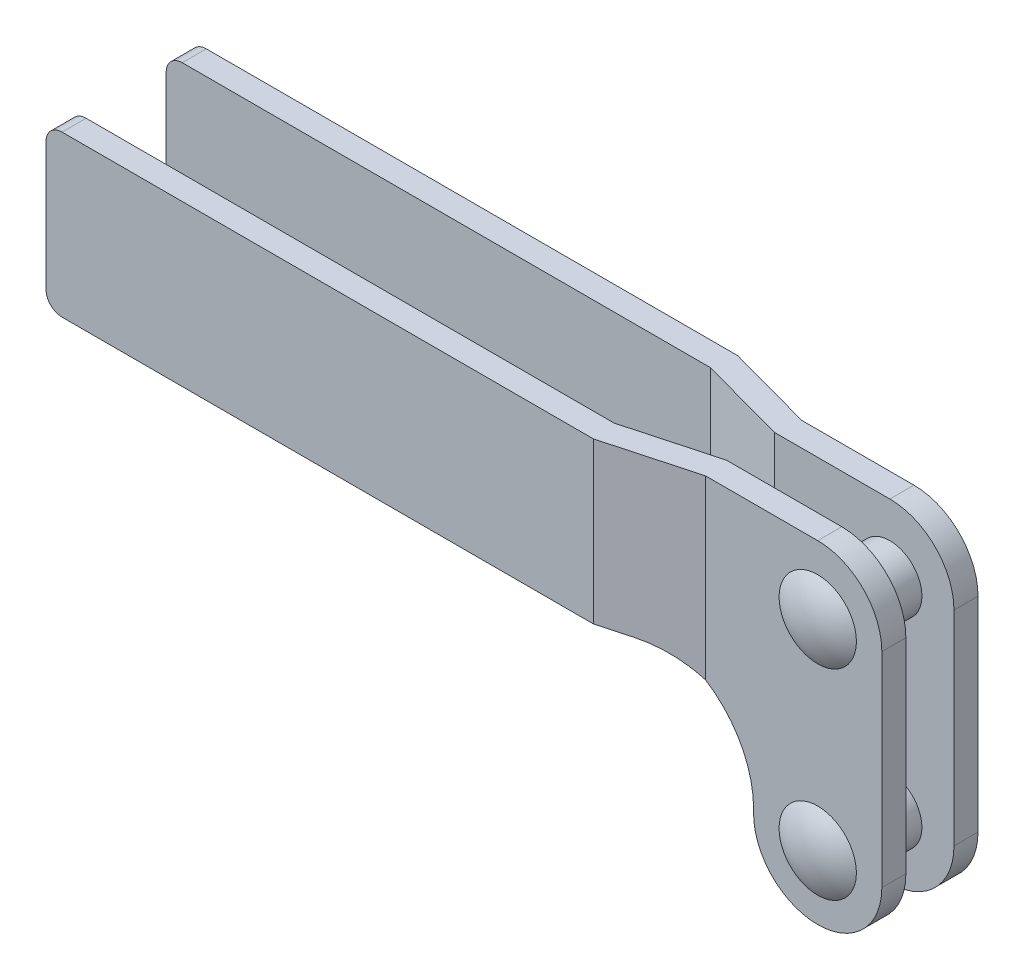
ISO-10303-21;
HEADER;
FILE_DESCRIPTION(('STEP AP214'),'2;1');
FILE_NAME('part.step','',(''),(''),'','','');
FILE_SCHEMA(('AUTOMOTIVE_DESIGN { 1 0 10303 214 1 1 1 1 }'));
ENDSEC;
DATA;
#1=APPLICATION_CONTEXT('core data for automotive mechanical design processes');
#2=APPLICATION_PROTOCOL_DEFINITION('international standard','automotive_design',2000,#1);
#3=PRODUCT_CONTEXT('',#1,'mechanical');
#4=PRODUCT('Part','Part','',(#3));
#5=PRODUCT_RELATED_PRODUCT_CATEGORY('part','',(#4));
#6=PRODUCT_DEFINITION_FORMATION('','',#4);
#7=PRODUCT_DEFINITION_CONTEXT('part definition',#1,'design');
#8=PRODUCT_DEFINITION('design','',#6,#7);
#9=PRODUCT_DEFINITION_SHAPE('','',#8);
#10=(LENGTH_UNIT() NAMED_UNIT(*) SI_UNIT(.MILLI.,.METRE.));
#11=(NAMED_UNIT(*) PLANE_ANGLE_UNIT() SI_UNIT($,.RADIAN.));
#12=(NAMED_UNIT(*) SI_UNIT($,.STERADIAN.) SOLID_ANGLE_UNIT());
#13=UNCERTAINTY_MEASURE_WITH_UNIT(LENGTH_MEASURE(1.E-05),#10,'distance_accuracy_value','');
#14=(GEOMETRIC_REPRESENTATION_CONTEXT(3) GLOBAL_UNCERTAINTY_ASSIGNED_CONTEXT((#13)) GLOBAL_UNIT_ASSIGNED_CONTEXT((#10,
#11,#12)) REPRESENTATION_CONTEXT('',''));
#15=CARTESIAN_POINT('',(0.,0.,0.));
#16=DIRECTION('',(0.,0.,1.));
#17=DIRECTION('',(1.,0.,0.));
#18=AXIS2_PLACEMENT_3D('',#15,#16,#17);
#19=CARTESIAN_POINT('',(-25.4017542509914,33.5,6.));
#20=DIRECTION('',(0.,0.,1.));
#21=DIRECTION('',(1.,0.,0.));
#22=AXIS2_PLACEMENT_3D('',#19,#20,#21);
#23=PLANE('',#22);
#24=CARTESIAN_POINT('',(-91.3,31.5,6.));
#25=DIRECTION('',(0.,0.,1.));
#26=DIRECTION('',(1.,0.,0.));
#27=AXIS2_PLACEMENT_3D('',#24,#25,#26);
#28=CIRCLE('',#27,2.);
#29=CARTESIAN_POINT('',(-91.3,33.5,6.));
#30=VERTEX_POINT('',#29);
#31=CARTESIAN_POINT('',(-93.3,31.5,6.));
#32=VERTEX_POINT('',#31);
#33=EDGE_CURVE('E301',#30,#32,#28,.T.);
#34=ORIENTED_EDGE('',*,*,#33,.F.);
#35=DIRECTION('',(-1.,0.,0.));
#36=VECTOR('',#35,1.);
#37=CARTESIAN_POINT('',(-25.4017542509914,33.5,6.));
#38=LINE('',#37,#36);
#39=CARTESIAN_POINT('',(-25.4017542509914,33.5,6.));
#40=VERTEX_POINT('',#39);
#41=EDGE_CURVE('E391',#40,#30,#38,.T.);
#42=ORIENTED_EDGE('',*,*,#41,.F.);
#43=DIRECTION('',(0.,-1.,0.));
#44=VECTOR('',#43,1.);
#45=CARTESIAN_POINT('',(-25.4017542509914,33.5,6.));
#46=LINE('',#45,#44);
#47=CARTESIAN_POINT('',(-25.4017542509914,13.5,6.));
#48=VERTEX_POINT('',#47);
#49=EDGE_CURVE('E405',#40,#48,#46,.T.);
#50=ORIENTED_EDGE('',*,*,#49,.T.);
#51=DIRECTION('',(1.,0.,0.));
#52=VECTOR('',#51,1.);
#53=CARTESIAN_POINT('',(-25.4017542509914,13.5,6.));
#54=LINE('',#53,#52);
#55=CARTESIAN_POINT('',(-91.3,13.5,6.));
#56=VERTEX_POINT('',#55);
#57=EDGE_CURVE('E49',#56,#48,#54,.T.);
#58=ORIENTED_EDGE('',*,*,#57,.F.);
#59=CARTESIAN_POINT('',(-91.3,15.5,6.));
#60=DIRECTION('',(0.,0.,1.));
#61=DIRECTION('',(1.,0.,0.));
#62=AXIS2_PLACEMENT_3D('',#59,#60,#61);
#63=CIRCLE('',#62,1.99999999999999);
#64=CARTESIAN_POINT('',(-93.3,15.5,6.));
#65=VERTEX_POINT('',#64);
#66=EDGE_CURVE('E224',#65,#56,#63,.T.);
#67=ORIENTED_EDGE('',*,*,#66,.F.);
#68=DIRECTION('',(0.,-1.,0.));
#69=VECTOR('',#68,1.);
#70=CARTESIAN_POINT('',(-93.3,33.5,6.));
#71=LINE('',#70,#69);
#72=EDGE_CURVE('E423',#32,#65,#71,.T.);
#73=ORIENTED_EDGE('',*,*,#72,.F.);
#74=EDGE_LOOP('',(#34,#42,#50,#58,#67,#73));
#75=FACE_BOUND('',#74,.T.);
#76=ADVANCED_FACE('F35',(#75),#23,.F.);
#77=CARTESIAN_POINT('',(-93.3,33.5,6.));
#78=DIRECTION('',(1.,0.,0.));
#79=DIRECTION('',(0.,0.,-1.));
#80=AXIS2_PLACEMENT_3D('',#77,#78,#79);
#81=PLANE('',#80);
#82=ORIENTED_EDGE('',*,*,#72,.T.);
#83=DIRECTION('',(0.,0.,1.));
#84=VECTOR('',#83,1.);
#85=CARTESIAN_POINT('',(-93.3,15.5,-9.));
#86=LINE('',#85,#84);
#87=CARTESIAN_POINT('',(-93.3,15.5,9.));
#88=VERTEX_POINT('',#87);
#89=EDGE_CURVE('E256',#65,#88,#86,.T.);
#90=ORIENTED_EDGE('',*,*,#89,.T.);
#91=DIRECTION('',(0.,-1.,0.));
#92=VECTOR('',#91,1.);
#93=CARTESIAN_POINT('',(-93.3,33.5,9.));
#94=LINE('',#93,#92);
#95=CARTESIAN_POINT('',(-93.3,31.5,9.));
#96=VERTEX_POINT('',#95);
#97=EDGE_CURVE('E243',#96,#88,#94,.T.);
#98=ORIENTED_EDGE('',*,*,#97,.F.);
#99=DIRECTION('',(0.,0.,1.));
#100=VECTOR('',#99,1.);
#101=CARTESIAN_POINT('',(-93.3,31.5,-9.));
#102=LINE('',#101,#100);
#103=EDGE_CURVE('E259',#32,#96,#102,.T.);
#104=ORIENTED_EDGE('',*,*,#103,.F.);
#105=EDGE_LOOP('',(#82,#90,#98,#104));
#106=FACE_BOUND('',#105,.T.);
#107=ADVANCED_FACE('F533',(#106),#81,.F.);
#108=CARTESIAN_POINT('',(-93.3,33.5,9.));
#109=DIRECTION('',(0.,0.,-1.));
#110=DIRECTION('',(-1.,0.,0.));
#111=AXIS2_PLACEMENT_3D('',#108,#109,#110);
#112=PLANE('',#111);
#113=CARTESIAN_POINT('',(-91.3,31.5,9.));
#114=DIRECTION('',(0.,0.,1.));
#115=DIRECTION('',(1.,0.,0.));
#116=AXIS2_PLACEMENT_3D('',#113,#114,#115);
#117=CIRCLE('',#116,2.);
#118=CARTESIAN_POINT('',(-91.3,33.5,9.));
#119=VERTEX_POINT('',#118);
#120=EDGE_CURVE('E237',#119,#96,#117,.T.);
#121=ORIENTED_EDGE('',*,*,#120,.T.);
#122=ORIENTED_EDGE('',*,*,#97,.T.);
#123=CARTESIAN_POINT('',(-91.3,15.5,9.));
#124=DIRECTION('',(0.,0.,1.));
#125=DIRECTION('',(1.,0.,0.));
#126=AXIS2_PLACEMENT_3D('',#123,#124,#125);
#127=CIRCLE('',#126,1.99999999999999);
#128=CARTESIAN_POINT('',(-91.3,13.5,9.));
#129=VERTEX_POINT('',#128);
#130=EDGE_CURVE('E221',#88,#129,#127,.T.);
#131=ORIENTED_EDGE('',*,*,#130,.T.);
#132=DIRECTION('',(1.,0.,0.));
#133=VECTOR('',#132,1.);
#134=CARTESIAN_POINT('',(-91.3,13.5,9.));
#135=LINE('',#134,#133);
#136=CARTESIAN_POINT('',(-25.,13.5,9.));
#137=VERTEX_POINT('',#136);
#138=EDGE_CURVE('E229',#129,#137,#135,.T.);
#139=ORIENTED_EDGE('',*,*,#138,.T.);
#140=DIRECTION('',(0.,-1.,0.));
#141=VECTOR('',#140,1.);
#142=CARTESIAN_POINT('',(-25.,33.5,9.));
#143=LINE('',#142,#141);
#144=CARTESIAN_POINT('',(-25.,33.5,9.));
#145=VERTEX_POINT('',#144);
#146=EDGE_CURVE('E420',#145,#137,#143,.T.);
#147=ORIENTED_EDGE('',*,*,#146,.F.);
#148=DIRECTION('',(1.,0.,0.));
#149=VECTOR('',#148,1.);
#150=CARTESIAN_POINT('',(-93.3,33.5,9.));
#151=LINE('',#150,#149);
#152=EDGE_CURVE('E394',#119,#145,#151,.T.);
#153=ORIENTED_EDGE('',*,*,#152,.F.);
#154=EDGE_LOOP('',(#121,#122,#131,#139,#147,#153));
#155=FACE_BOUND('',#154,.T.);
#156=ADVANCED_FACE('F241',(#155),#112,.F.);
#157=CARTESIAN_POINT('',(-25.,33.5,9.));
#158=DIRECTION('',(-0.263117405792109,0.,-0.964763821237732));
#159=DIRECTION('',(-0.964763821237732,0.,0.263117405792109));
#160=AXIS2_PLACEMENT_3D('',#157,#158,#159);
#161=PLANE('',#160);
#162=CARTESIAN_POINT('',(-21.,0.499999999999995,7.90909090909091));
#163=DIRECTION('',(-0.263117405792109,0.,-0.964763821237732));
#164=DIRECTION('',(-0.964763821237732,0.,0.263117405792109));
#165=AXIS2_PLACEMENT_3D('',#162,#163,#164);
#166=ELLIPSE('',#165,13.4748004784444,13.);
#167=CARTESIAN_POINT('',(-14.,11.4544511501033,6.));
#168=VERTEX_POINT('',#167);
#169=CARTESIAN_POINT('',(-21.,13.5,7.90909090909091));
#170=VERTEX_POINT('',#169);
#171=EDGE_CURVE('E328',#168,#170,#166,.F.);
#172=ORIENTED_EDGE('',*,*,#171,.F.);
#173=DIRECTION('',(0.,-1.,0.));
#174=VECTOR('',#173,1.);
#175=CARTESIAN_POINT('',(-14.,33.5,6.));
#176=LINE('',#175,#174);
#177=CARTESIAN_POINT('',(-14.,33.5,6.));
#178=VERTEX_POINT('',#177);
#179=EDGE_CURVE('E417',#178,#168,#176,.T.);
#180=ORIENTED_EDGE('',*,*,#179,.F.);
#181=DIRECTION('',(0.964763821237732,0.,-0.263117405792109));
#182=VECTOR('',#181,1.);
#183=CARTESIAN_POINT('',(-25.,33.5,9.));
#184=LINE('',#183,#182);
#185=EDGE_CURVE('E396',#145,#178,#184,.T.);
#186=ORIENTED_EDGE('',*,*,#185,.F.);
#187=ORIENTED_EDGE('',*,*,#146,.T.);
#188=DIRECTION('',(-0.964763821237732,0.,0.263117405792109));
#189=VECTOR('',#188,1.);
#190=CARTESIAN_POINT('',(-25.,13.5,9.));
#191=LINE('',#190,#189);
#192=EDGE_CURVE('E233',#170,#137,#191,.T.);
#193=ORIENTED_EDGE('',*,*,#192,.F.);
#194=EDGE_LOOP('',(#172,#180,#186,#187,#193));
#195=FACE_BOUND('',#194,.T.);
#196=ADVANCED_FACE('F559',(#195),#161,.F.);
#197=CARTESIAN_POINT('',(8.,33.5,6.));
#198=DIRECTION('',(-1.,0.,0.));
#199=DIRECTION('',(0.,0.,1.));
#200=AXIS2_PLACEMENT_3D('',#197,#198,#199);
#201=PLANE('',#200);
#202=DIRECTION('',(0.,-1.,0.));
#203=VECTOR('',#202,1.);
#204=CARTESIAN_POINT('',(8.,33.5,3.));
#205=LINE('',#204,#203);
#206=CARTESIAN_POINT('',(8.,25.5,3.));
#207=VERTEX_POINT('',#206);
#208=CARTESIAN_POINT('',(8.,0.,3.));
#209=VERTEX_POINT('',#208);
#210=EDGE_CURVE('E411',#207,#209,#205,.T.);
#211=ORIENTED_EDGE('',*,*,#210,.F.);
#212=DIRECTION('',(0.,0.,1.));
#213=VECTOR('',#212,1.);
#214=CARTESIAN_POINT('',(8.,25.5,-9.));
#215=LINE('',#214,#213);
#216=CARTESIAN_POINT('',(8.,25.5,6.));
#217=VERTEX_POINT('',#216);
#218=EDGE_CURVE('E267',#207,#217,#215,.T.);
#219=ORIENTED_EDGE('',*,*,#218,.T.);
#220=DIRECTION('',(0.,-1.,0.));
#221=VECTOR('',#220,1.);
#222=CARTESIAN_POINT('',(8.,33.5,6.));
#223=LINE('',#222,#221);
#224=CARTESIAN_POINT('',(8.,0.,6.));
#225=VERTEX_POINT('',#224);
#226=EDGE_CURVE('E414',#217,#225,#223,.T.);
#227=ORIENTED_EDGE('',*,*,#226,.T.);
#228=DIRECTION('',(0.,0.,1.));
#229=VECTOR('',#228,1.);
#230=CARTESIAN_POINT('',(8.,0.,-9.));
#231=LINE('',#230,#229);
#232=EDGE_CURVE('E271',#209,#225,#231,.T.);
#233=ORIENTED_EDGE('',*,*,#232,.F.);
#234=EDGE_LOOP('',(#211,#219,#227,#233));
#235=FACE_BOUND('',#234,.T.);
#236=ADVANCED_FACE('F569',(#235),#201,.F.);
#237=CARTESIAN_POINT('',(-14.4017542509914,33.5,3.));
#238=DIRECTION('',(0.263117405792109,0.,0.964763821237732));
#239=DIRECTION('',(0.964763821237732,0.,-0.263117405792109));
#240=AXIS2_PLACEMENT_3D('',#237,#238,#239);
#241=PLANE('',#240);
#242=CARTESIAN_POINT('',(-21.,0.499999999999995,4.79952156791144));
#243=DIRECTION('',(0.263117405792109,0.,0.964763821237732));
#244=DIRECTION('',(-0.964763821237732,0.,0.263117405792109));
#245=AXIS2_PLACEMENT_3D('',#242,#243,#244);
#246=ELLIPSE('',#245,13.4748004784444,13.);
#247=CARTESIAN_POINT('',(-21.,13.5,4.79952156791144));
#248=VERTEX_POINT('',#247);
#249=CARTESIAN_POINT('',(-14.4017542509914,11.7010335699742,3.));
#250=VERTEX_POINT('',#249);
#251=EDGE_CURVE('E322',#248,#250,#246,.F.);
#252=ORIENTED_EDGE('',*,*,#251,.F.);
#253=DIRECTION('',(0.964763821237732,0.,-0.263117405792109));
#254=VECTOR('',#253,1.);
#255=CARTESIAN_POINT('',(-14.4017542509914,13.5,3.));
#256=LINE('',#255,#254);
#257=EDGE_CURVE('E309',#48,#248,#256,.T.);
#258=ORIENTED_EDGE('',*,*,#257,.F.);
#259=ORIENTED_EDGE('',*,*,#49,.F.);
#260=DIRECTION('',(-0.964763821237732,0.,0.263117405792109));
#261=VECTOR('',#260,1.);
#262=CARTESIAN_POINT('',(-14.4017542509914,33.5,3.));
#263=LINE('',#262,#261);
#264=CARTESIAN_POINT('',(-14.4017542509914,33.5,3.));
#265=VERTEX_POINT('',#264);
#266=EDGE_CURVE('E403',#265,#40,#263,.T.);
#267=ORIENTED_EDGE('',*,*,#266,.F.);
#268=DIRECTION('',(0.,-1.,0.));
#269=VECTOR('',#268,1.);
#270=CARTESIAN_POINT('',(-14.4017542509914,33.5,3.));
#271=LINE('',#270,#269);
#272=EDGE_CURVE('E408',#265,#250,#271,.T.);
#273=ORIENTED_EDGE('',*,*,#272,.T.);
#274=EDGE_LOOP('',(#252,#258,#259,#267,#273));
#275=FACE_BOUND('',#274,.T.);
#276=ADVANCED_FACE('F553',(#275),#241,.F.);
#277=CARTESIAN_POINT('',(0.,33.5,0.));
#278=DIRECTION('',(0.,1.,0.));
#279=DIRECTION('',(0.,0.,1.));
#280=AXIS2_PLACEMENT_3D('',#277,#278,#279);
#281=PLANE('',#280);
#282=ORIENTED_EDGE('',*,*,#41,.T.);
#283=DIRECTION('',(0.,0.,1.));
#284=VECTOR('',#283,1.);
#285=CARTESIAN_POINT('',(-91.3,33.5,-9.));
#286=LINE('',#285,#284);
#287=EDGE_CURVE('E263',#30,#119,#286,.T.);
#288=ORIENTED_EDGE('',*,*,#287,.T.);
#289=ORIENTED_EDGE('',*,*,#152,.T.);
#290=ORIENTED_EDGE('',*,*,#185,.T.);
#291=DIRECTION('',(1.,0.,0.));
#292=VECTOR('',#291,1.);
#293=CARTESIAN_POINT('',(-14.,33.5,6.));
#294=LINE('',#293,#292);
#295=CARTESIAN_POINT('',(0.,33.5,6.));
#296=VERTEX_POINT('',#295);
#297=EDGE_CURVE('E398',#178,#296,#294,.T.);
#298=ORIENTED_EDGE('',*,*,#297,.T.);
#299=DIRECTION('',(0.,0.,1.));
#300=VECTOR('',#299,1.);
#301=CARTESIAN_POINT('',(0.,33.5,-9.));
#302=LINE('',#301,#300);
#303=CARTESIAN_POINT('',(0.,33.5,3.));
#304=VERTEX_POINT('',#303);
#305=EDGE_CURVE('E264',#304,#296,#302,.T.);
#306=ORIENTED_EDGE('',*,*,#305,.F.);
#307=DIRECTION('',(-1.,0.,0.));
#308=VECTOR('',#307,1.);
#309=CARTESIAN_POINT('',(8.,33.5,3.));
#310=LINE('',#309,#308);
#311=EDGE_CURVE('E401',#304,#265,#310,.T.);
#312=ORIENTED_EDGE('',*,*,#311,.T.);
#313=ORIENTED_EDGE('',*,*,#266,.T.);
#314=EDGE_LOOP('',(#282,#288,#289,#290,#298,#306,#312,#313));
#315=FACE_BOUND('',#314,.T.);
#316=ADVANCED_FACE('F545',(#315),#281,.T.);
#317=CARTESIAN_POINT('',(-93.3,33.5,-9.));
#318=DIRECTION('',(1.,0.,0.));
#319=DIRECTION('',(0.,0.,-1.));
#320=AXIS2_PLACEMENT_3D('',#317,#318,#319);
#321=PLANE('',#320);
#322=DIRECTION('',(0.,-1.,0.));
#323=VECTOR('',#322,1.);
#324=CARTESIAN_POINT('',(-93.3,33.5,-9.));
#325=LINE('',#324,#323);
#326=CARTESIAN_POINT('',(-93.3,31.5,-9.));
#327=VERTEX_POINT('',#326);
#328=CARTESIAN_POINT('',(-93.3,15.5,-9.));
#329=VERTEX_POINT('',#328);
#330=EDGE_CURVE('E350',#327,#329,#325,.T.);
#331=ORIENTED_EDGE('',*,*,#330,.T.);
#332=CARTESIAN_POINT('',(-93.3,15.5,-6.));
#333=VERTEX_POINT('',#332);
#334=EDGE_CURVE('E252',#329,#333,#86,.T.);
#335=ORIENTED_EDGE('',*,*,#334,.T.);
#336=DIRECTION('',(0.,-1.,0.));
#337=VECTOR('',#336,1.);
#338=CARTESIAN_POINT('',(-93.3,33.5,-6.));
#339=LINE('',#338,#337);
#340=CARTESIAN_POINT('',(-93.3,31.5,-6.));
#341=VERTEX_POINT('',#340);
#342=EDGE_CURVE('E371',#341,#333,#339,.T.);
#343=ORIENTED_EDGE('',*,*,#342,.F.);
#344=EDGE_CURVE('E257',#327,#341,#102,.T.);
#345=ORIENTED_EDGE('',*,*,#344,.F.);
#346=EDGE_LOOP('',(#331,#335,#343,#345));
#347=FACE_BOUND('',#346,.T.);
#348=ADVANCED_FACE('F512',(#347),#321,.F.);
#349=CARTESIAN_POINT('',(-93.3,33.5,-6.));
#350=DIRECTION('',(0.,0.,-1.));
#351=DIRECTION('',(-1.,0.,0.));
#352=AXIS2_PLACEMENT_3D('',#349,#350,#351);
#353=PLANE('',#352);
#354=CARTESIAN_POINT('',(-91.3,31.5,-6.));
#355=DIRECTION('',(0.,0.,-1.));
#356=DIRECTION('',(-1.,0.,0.));
#357=AXIS2_PLACEMENT_3D('',#354,#355,#356);
#358=CIRCLE('',#357,2.);
#359=CARTESIAN_POINT('',(-91.3,33.5,-6.));
#360=VERTEX_POINT('',#359);
#361=EDGE_CURVE('E299',#341,#360,#358,.T.);
#362=ORIENTED_EDGE('',*,*,#361,.F.);
#363=ORIENTED_EDGE('',*,*,#342,.T.);
#364=CARTESIAN_POINT('',(-91.3,15.5,-6.));
#365=DIRECTION('',(0.,0.,-1.));
#366=DIRECTION('',(-1.,0.,0.));
#367=AXIS2_PLACEMENT_3D('',#364,#365,#366);
#368=CIRCLE('',#367,1.99999999999999);
#369=CARTESIAN_POINT('',(-91.3,13.5,-6.));
#370=VERTEX_POINT('',#369);
#371=EDGE_CURVE('E313',#370,#333,#368,.T.);
#372=ORIENTED_EDGE('',*,*,#371,.F.);
#373=DIRECTION('',(-1.,0.,0.));
#374=VECTOR('',#373,1.);
#375=CARTESIAN_POINT('',(-93.3,13.5,-6.));
#376=LINE('',#375,#374);
#377=CARTESIAN_POINT('',(-25.4017542509914,13.5,-6.));
#378=VERTEX_POINT('',#377);
#379=EDGE_CURVE('E307',#378,#370,#376,.T.);
#380=ORIENTED_EDGE('',*,*,#379,.F.);
#381=DIRECTION('',(0.,-1.,0.));
#382=VECTOR('',#381,1.);
#383=CARTESIAN_POINT('',(-25.4017542509914,33.5,-6.));
#384=LINE('',#383,#382);
#385=CARTESIAN_POINT('',(-25.4017542509914,33.5,-6.));
#386=VERTEX_POINT('',#385);
#387=EDGE_CURVE('E368',#386,#378,#384,.T.);
#388=ORIENTED_EDGE('',*,*,#387,.F.);
#389=DIRECTION('',(1.,0.,0.));
#390=VECTOR('',#389,1.);
#391=CARTESIAN_POINT('',(-93.3,33.5,-6.));
#392=LINE('',#391,#390);
#393=EDGE_CURVE('E336',#360,#386,#392,.T.);
#394=ORIENTED_EDGE('',*,*,#393,.F.);
#395=EDGE_LOOP('',(#362,#363,#372,#380,#388,#394));
#396=FACE_BOUND('',#395,.T.);
#397=ADVANCED_FACE('F497',(#396),#353,.F.);
#398=CARTESIAN_POINT('',(-25.4017542509914,33.5,-6.));
#399=DIRECTION('',(0.263117405792109,0.,-0.964763821237732));
#400=DIRECTION('',(-0.964763821237732,0.,-0.263117405792109));
#401=AXIS2_PLACEMENT_3D('',#398,#399,#400);
#402=PLANE('',#401);
#403=CARTESIAN_POINT('',(-21.,0.499999999999995,-4.79952156791144));
#404=DIRECTION('',(0.263117405792109,0.,-0.964763821237732));
#405=DIRECTION('',(0.964763821237732,0.,0.263117405792109));
#406=AXIS2_PLACEMENT_3D('',#403,#404,#405);
#407=ELLIPSE('',#406,13.4748004784444,13.);
#408=CARTESIAN_POINT('',(-14.4017542509914,11.7010335699742,-3.));
#409=VERTEX_POINT('',#408);
#410=CARTESIAN_POINT('',(-21.,13.5,-4.79952156791144));
#411=VERTEX_POINT('',#410);
#412=EDGE_CURVE('E320',#409,#411,#407,.F.);
#413=ORIENTED_EDGE('',*,*,#412,.F.);
#414=DIRECTION('',(0.,-1.,0.));
#415=VECTOR('',#414,1.);
#416=CARTESIAN_POINT('',(-14.4017542509914,33.5,-3.));
#417=LINE('',#416,#415);
#418=CARTESIAN_POINT('',(-14.4017542509914,33.5,-3.));
#419=VERTEX_POINT('',#418);
#420=EDGE_CURVE('E365',#419,#409,#417,.T.);
#421=ORIENTED_EDGE('',*,*,#420,.F.);
#422=DIRECTION('',(0.964763821237732,0.,0.263117405792109));
#423=VECTOR('',#422,1.);
#424=CARTESIAN_POINT('',(-25.4017542509914,33.5,-6.));
#425=LINE('',#424,#423);
#426=EDGE_CURVE('E338',#386,#419,#425,.T.);
#427=ORIENTED_EDGE('',*,*,#426,.F.);
#428=ORIENTED_EDGE('',*,*,#387,.T.);
#429=DIRECTION('',(-0.964763821237732,0.,-0.263117405792109));
#430=VECTOR('',#429,1.);
#431=CARTESIAN_POINT('',(-25.4017542509914,13.5,-6.));
#432=LINE('',#431,#430);
#433=EDGE_CURVE('E305',#411,#378,#432,.T.);
#434=ORIENTED_EDGE('',*,*,#433,.F.);
#435=EDGE_LOOP('',(#413,#421,#427,#428,#434));
#436=FACE_BOUND('',#435,.T.);
#437=ADVANCED_FACE('F489',(#436),#402,.F.);
#438=CARTESIAN_POINT('',(8.,33.5,-3.));
#439=DIRECTION('',(-1.,0.,0.));
#440=DIRECTION('',(0.,0.,1.));
#441=AXIS2_PLACEMENT_3D('',#438,#439,#440);
#442=PLANE('',#441);
#443=DIRECTION('',(0.,-1.,0.));
#444=VECTOR('',#443,1.);
#445=CARTESIAN_POINT('',(8.,33.5,-6.));
#446=LINE('',#445,#444);
#447=CARTESIAN_POINT('',(8.,25.5,-6.));
#448=VERTEX_POINT('',#447);
#449=CARTESIAN_POINT('',(8.,0.,-6.));
#450=VERTEX_POINT('',#449);
#451=EDGE_CURVE('E359',#448,#450,#446,.T.);
#452=ORIENTED_EDGE('',*,*,#451,.F.);
#453=CARTESIAN_POINT('',(8.,25.5,-3.));
#454=VERTEX_POINT('',#453);
#455=EDGE_CURVE('E266',#448,#454,#215,.T.);
#456=ORIENTED_EDGE('',*,*,#455,.T.);
#457=DIRECTION('',(0.,-1.,0.));
#458=VECTOR('',#457,1.);
#459=CARTESIAN_POINT('',(8.,33.5,-3.));
#460=LINE('',#459,#458);
#461=CARTESIAN_POINT('',(8.,0.,-3.));
#462=VERTEX_POINT('',#461);
#463=EDGE_CURVE('E362',#454,#462,#460,.T.);
#464=ORIENTED_EDGE('',*,*,#463,.T.);
#465=EDGE_CURVE('E270',#450,#462,#231,.T.);
#466=ORIENTED_EDGE('',*,*,#465,.F.);
#467=EDGE_LOOP('',(#452,#456,#464,#466));
#468=FACE_BOUND('',#467,.T.);
#469=ADVANCED_FACE('F470',(#468),#442,.F.);
#470=CARTESIAN_POINT('',(-14.,33.5,-6.));
#471=DIRECTION('',(-0.263117405792109,0.,0.964763821237732));
#472=DIRECTION('',(0.964763821237732,0.,0.263117405792109));
#473=AXIS2_PLACEMENT_3D('',#470,#471,#472);
#474=PLANE('',#473);
#475=CARTESIAN_POINT('',(-21.,0.499999999999995,-7.90909090909091));
#476=DIRECTION('',(-0.263117405792109,0.,0.964763821237732));
#477=DIRECTION('',(0.964763821237732,0.,0.263117405792109));
#478=AXIS2_PLACEMENT_3D('',#475,#476,#477);
#479=ELLIPSE('',#478,13.4748004784444,13.);
#480=CARTESIAN_POINT('',(-21.,13.5,-7.90909090909091));
#481=VERTEX_POINT('',#480);
#482=CARTESIAN_POINT('',(-14.,11.4544511501033,-6.));
#483=VERTEX_POINT('',#482);
#484=EDGE_CURVE('E42',#481,#483,#479,.F.);
#485=ORIENTED_EDGE('',*,*,#484,.F.);
#486=DIRECTION('',(0.964763821237732,0.,0.263117405792109));
#487=VECTOR('',#486,1.);
#488=CARTESIAN_POINT('',(-14.,13.5,-6.));
#489=LINE('',#488,#487);
#490=CARTESIAN_POINT('',(-25.,13.5,-9.));
#491=VERTEX_POINT('',#490);
#492=EDGE_CURVE('E303',#491,#481,#489,.T.);
#493=ORIENTED_EDGE('',*,*,#492,.F.);
#494=DIRECTION('',(0.,-1.,0.));
#495=VECTOR('',#494,1.);
#496=CARTESIAN_POINT('',(-25.,33.5,-9.));
#497=LINE('',#496,#495);
#498=CARTESIAN_POINT('',(-25.,33.5,-9.));
#499=VERTEX_POINT('',#498);
#500=EDGE_CURVE('E353',#499,#491,#497,.T.);
#501=ORIENTED_EDGE('',*,*,#500,.F.);
#502=DIRECTION('',(-0.964763821237732,0.,-0.263117405792109));
#503=VECTOR('',#502,1.);
#504=CARTESIAN_POINT('',(-14.,33.5,-6.));
#505=LINE('',#504,#503);
#506=CARTESIAN_POINT('',(-14.,33.5,-6.));
#507=VERTEX_POINT('',#506);
#508=EDGE_CURVE('E345',#507,#499,#505,.T.);
#509=ORIENTED_EDGE('',*,*,#508,.F.);
#510=DIRECTION('',(0.,-1.,0.));
#511=VECTOR('',#510,1.);
#512=CARTESIAN_POINT('',(-14.,33.5,-6.));
#513=LINE('',#512,#511);
#514=EDGE_CURVE('E356',#507,#483,#513,.T.);
#515=ORIENTED_EDGE('',*,*,#514,.T.);
#516=EDGE_LOOP('',(#485,#493,#501,#509,#515));
#517=FACE_BOUND('',#516,.T.);
#518=ADVANCED_FACE('F459',(#517),#474,.F.);
#519=CARTESIAN_POINT('',(-25.,33.5,-9.));
#520=DIRECTION('',(0.,0.,1.));
#521=DIRECTION('',(1.,0.,0.));
#522=AXIS2_PLACEMENT_3D('',#519,#520,#521);
#523=PLANE('',#522);
#524=CARTESIAN_POINT('',(-91.3,31.5,-9.));
#525=DIRECTION('',(0.,0.,1.));
#526=DIRECTION('',(1.,0.,0.));
#527=AXIS2_PLACEMENT_3D('',#524,#525,#526);
#528=CIRCLE('',#527,2.);
#529=CARTESIAN_POINT('',(-91.3,33.5,-9.));
#530=VERTEX_POINT('',#529);
#531=EDGE_CURVE('E226',#530,#327,#528,.T.);
#532=ORIENTED_EDGE('',*,*,#531,.F.);
#533=DIRECTION('',(-1.,0.,0.));
#534=VECTOR('',#533,1.);
#535=CARTESIAN_POINT('',(-25.,33.5,-9.));
#536=LINE('',#535,#534);
#537=EDGE_CURVE('E347',#499,#530,#536,.T.);
#538=ORIENTED_EDGE('',*,*,#537,.F.);
#539=ORIENTED_EDGE('',*,*,#500,.T.);
#540=DIRECTION('',(1.,0.,0.));
#541=VECTOR('',#540,1.);
#542=CARTESIAN_POINT('',(-91.3,13.5,-9.));
#543=LINE('',#542,#541);
#544=CARTESIAN_POINT('',(-91.3,13.5,-9.));
#545=VERTEX_POINT('',#544);
#546=EDGE_CURVE('E249',#545,#491,#543,.T.);
#547=ORIENTED_EDGE('',*,*,#546,.F.);
#548=CARTESIAN_POINT('',(-91.3,15.5,-9.));
#549=DIRECTION('',(0.,0.,1.));
#550=DIRECTION('',(1.,0.,0.));
#551=AXIS2_PLACEMENT_3D('',#548,#549,#550);
#552=CIRCLE('',#551,1.99999999999999);
#553=EDGE_CURVE('E247',#329,#545,#552,.T.);
#554=ORIENTED_EDGE('',*,*,#553,.F.);
#555=ORIENTED_EDGE('',*,*,#330,.F.);
#556=EDGE_LOOP('',(#532,#538,#539,#547,#554,#555));
#557=FACE_BOUND('',#556,.T.);
#558=ADVANCED_FACE('F509',(#557),#523,.F.);
#559=CARTESIAN_POINT('',(0.,33.5,0.));
#560=DIRECTION('',(0.,1.,0.));
#561=DIRECTION('',(0.,0.,1.));
#562=AXIS2_PLACEMENT_3D('',#559,#560,#561);
#563=PLANE('',#562);
#564=ORIENTED_EDGE('',*,*,#537,.T.);
#565=EDGE_CURVE('E260',#530,#360,#286,.T.);
#566=ORIENTED_EDGE('',*,*,#565,.T.);
#567=ORIENTED_EDGE('',*,*,#393,.T.);
#568=ORIENTED_EDGE('',*,*,#426,.T.);
#569=DIRECTION('',(1.,0.,0.));
#570=VECTOR('',#569,1.);
#571=CARTESIAN_POINT('',(-14.4017542509914,33.5,-3.));
#572=LINE('',#571,#570);
#573=CARTESIAN_POINT('',(0.,33.5,-3.));
#574=VERTEX_POINT('',#573);
#575=EDGE_CURVE('E340',#419,#574,#572,.T.);
#576=ORIENTED_EDGE('',*,*,#575,.T.);
#577=DIRECTION('',(0.,0.,1.));
#578=VECTOR('',#577,1.);
#579=CARTESIAN_POINT('',(0.,33.5,-9.));
#580=LINE('',#579,#578);
#581=CARTESIAN_POINT('',(0.,33.5,-6.));
#582=VERTEX_POINT('',#581);
#583=EDGE_CURVE('E378',#582,#574,#580,.T.);
#584=ORIENTED_EDGE('',*,*,#583,.F.);
#585=DIRECTION('',(-1.,0.,0.));
#586=VECTOR('',#585,1.);
#587=CARTESIAN_POINT('',(8.,33.5,-6.));
#588=LINE('',#587,#586);
#589=EDGE_CURVE('E343',#582,#507,#588,.T.);
#590=ORIENTED_EDGE('',*,*,#589,.T.);
#591=ORIENTED_EDGE('',*,*,#508,.T.);
#592=EDGE_LOOP('',(#564,#566,#567,#568,#576,#584,#590,#591));
#593=FACE_BOUND('',#592,.T.);
#594=ADVANCED_FACE('F463',(#593),#563,.T.);
#595=CARTESIAN_POINT('',(0.,0.,-7.));
#596=DIRECTION('',(0.,0.,1.));
#597=DIRECTION('',(0.,-1.,0.));
#598=AXIS2_PLACEMENT_3D('',#595,#596,#597);
#599=CYLINDRICAL_SURFACE('',#598,4.);
#600=CARTESIAN_POINT('',(0.,0.,3.));
#601=DIRECTION('',(0.,0.,1.));
#602=DIRECTION('',(1.,0.,0.));
#603=AXIS2_PLACEMENT_3D('',#600,#601,#602);
#604=CIRCLE('',#603,4.);
#605=CARTESIAN_POINT('',(4.,0.,3.));
#606=VERTEX_POINT('',#605);
#607=EDGE_CURVE('E426',#606,#606,#604,.F.);
#608=ORIENTED_EDGE('',*,*,#607,.T.);
#609=EDGE_LOOP('',(#608));
#610=FACE_BOUND('',#609,.T.);
#611=CARTESIAN_POINT('',(0.,0.,-3.));
#612=DIRECTION('',(0.,0.,-1.));
#613=DIRECTION('',(-1.,0.,0.));
#614=AXIS2_PLACEMENT_3D('',#611,#612,#613);
#615=CIRCLE('',#614,4.);
#616=CARTESIAN_POINT('',(-4.,0.,-3.));
#617=VERTEX_POINT('',#616);
#618=EDGE_CURVE('E375',#617,#617,#615,.T.);
#619=ORIENTED_EDGE('',*,*,#618,.F.);
#620=EDGE_LOOP('',(#619));
#621=FACE_BOUND('',#620,.T.);
#622=ADVANCED_FACE('F599',(#610,#621),#599,.T.);
#623=CARTESIAN_POINT('',(0.,25.,-7.));
#624=DIRECTION('',(0.,0.,1.));
#625=DIRECTION('',(1.,0.,0.));
#626=AXIS2_PLACEMENT_3D('',#623,#624,#625);
#627=CYLINDRICAL_SURFACE('',#626,4.);
#628=CARTESIAN_POINT('',(0.,25.,3.));
#629=DIRECTION('',(0.,0.,1.));
#630=DIRECTION('',(1.,0.,0.));
#631=AXIS2_PLACEMENT_3D('',#628,#629,#630);
#632=CIRCLE('',#631,4.);
#633=CARTESIAN_POINT('',(4.,25.,3.));
#634=VERTEX_POINT('',#633);
#635=EDGE_CURVE('E432',#634,#634,#632,.F.);
#636=ORIENTED_EDGE('',*,*,#635,.T.);
#637=EDGE_LOOP('',(#636));
#638=FACE_BOUND('',#637,.T.);
#639=CARTESIAN_POINT('',(0.,25.,-3.));
#640=DIRECTION('',(0.,0.,-1.));
#641=DIRECTION('',(-1.,0.,0.));
#642=AXIS2_PLACEMENT_3D('',#639,#640,#641);
#643=CIRCLE('',#642,4.);
#644=CARTESIAN_POINT('',(-4.,25.,-3.));
#645=VERTEX_POINT('',#644);
#646=EDGE_CURVE('E379',#645,#645,#643,.T.);
#647=ORIENTED_EDGE('',*,*,#646,.F.);
#648=EDGE_LOOP('',(#647));
#649=FACE_BOUND('',#648,.T.);
#650=ADVANCED_FACE('F626',(#638,#649),#627,.T.);
#651=CARTESIAN_POINT('',(-14.,33.5,6.));
#652=DIRECTION('',(0.,0.,-1.));
#653=DIRECTION('',(-1.,0.,0.));
#654=AXIS2_PLACEMENT_3D('',#651,#652,#653);
#655=PLANE('',#654);
#656=CARTESIAN_POINT('',(0.,25.5,6.));
#657=DIRECTION('',(0.,0.,-1.));
#658=DIRECTION('',(-1.,0.,0.));
#659=AXIS2_PLACEMENT_3D('',#656,#657,#658);
#660=CIRCLE('',#659,8.00000000000001);
#661=EDGE_CURVE('E297',#296,#217,#660,.T.);
#662=ORIENTED_EDGE('',*,*,#661,.F.);
#663=ORIENTED_EDGE('',*,*,#297,.F.);
#664=ORIENTED_EDGE('',*,*,#179,.T.);
#665=CARTESIAN_POINT('',(-21.,0.499999999999995,6.));
#666=DIRECTION('',(0.,0.,-1.));
#667=DIRECTION('',(-1.,0.,0.));
#668=AXIS2_PLACEMENT_3D('',#665,#666,#667);
#669=CIRCLE('',#668,13.);
#670=CARTESIAN_POINT('',(-8.,0.5,6.));
#671=VERTEX_POINT('',#670);
#672=EDGE_CURVE('E326',#671,#168,#669,.F.);
#673=ORIENTED_EDGE('',*,*,#672,.F.);
#674=DIRECTION('',(0.,1.,0.));
#675=VECTOR('',#674,1.);
#676=CARTESIAN_POINT('',(-8.,33.5,6.));
#677=LINE('',#676,#675);
#678=CARTESIAN_POINT('',(-8.,0.,6.));
#679=VERTEX_POINT('',#678);
#680=EDGE_CURVE('E334',#679,#671,#677,.T.);
#681=ORIENTED_EDGE('',*,*,#680,.F.);
#682=CARTESIAN_POINT('',(0.,0.,6.));
#683=DIRECTION('',(0.,0.,-1.));
#684=DIRECTION('',(-1.,0.,0.));
#685=AXIS2_PLACEMENT_3D('',#682,#683,#684);
#686=CIRCLE('',#685,8.);
#687=EDGE_CURVE('E290',#225,#679,#686,.T.);
#688=ORIENTED_EDGE('',*,*,#687,.F.);
#689=ORIENTED_EDGE('',*,*,#226,.F.);
#690=EDGE_LOOP('',(#662,#663,#664,#673,#681,#688,#689));
#691=FACE_BOUND('',#690,.T.);
#692=CARTESIAN_POINT('',(0.,25.,6.));
#693=DIRECTION('',(0.,0.,-1.));
#694=DIRECTION('',(-1.,0.,0.));
#695=AXIS2_PLACEMENT_3D('',#692,#693,#694);
#696=CIRCLE('',#695,4.8218253804965);
#697=CARTESIAN_POINT('',(-4.8218253804965,25.,6.));
#698=VERTEX_POINT('',#697);
#699=EDGE_CURVE('E435',#698,#698,#696,.F.);
#700=ORIENTED_EDGE('',*,*,#699,.F.);
#701=EDGE_LOOP('',(#700));
#702=FACE_BOUND('',#701,.T.);
#703=CARTESIAN_POINT('',(0.,0.,6.));
#704=DIRECTION('',(0.,0.,-1.));
#705=DIRECTION('',(-1.,0.,0.));
#706=AXIS2_PLACEMENT_3D('',#703,#704,#705);
#707=CIRCLE('',#706,4.82182538049649);
#708=CARTESIAN_POINT('',(-4.82182538049649,0.,6.));
#709=VERTEX_POINT('',#708);
#710=EDGE_CURVE('E429',#709,#709,#707,.F.);
#711=ORIENTED_EDGE('',*,*,#710,.F.);
#712=EDGE_LOOP('',(#711));
#713=FACE_BOUND('',#712,.T.);
#714=ADVANCED_FACE('F563',(#691,#702,#713),#655,.F.);
#715=CARTESIAN_POINT('',(8.,33.5,3.));
#716=DIRECTION('',(0.,0.,1.));
#717=DIRECTION('',(1.,0.,0.));
#718=AXIS2_PLACEMENT_3D('',#715,#716,#717);
#719=PLANE('',#718);
#720=CARTESIAN_POINT('',(0.,25.5,3.));
#721=DIRECTION('',(0.,0.,1.));
#722=DIRECTION('',(1.,0.,0.));
#723=AXIS2_PLACEMENT_3D('',#720,#721,#722);
#724=CIRCLE('',#723,8.00000000000001);
#725=EDGE_CURVE('E57',#207,#304,#724,.T.);
#726=ORIENTED_EDGE('',*,*,#725,.F.);
#727=ORIENTED_EDGE('',*,*,#210,.T.);
#728=CARTESIAN_POINT('',(0.,0.,3.));
#729=DIRECTION('',(0.,0.,1.));
#730=DIRECTION('',(1.,0.,0.));
#731=AXIS2_PLACEMENT_3D('',#728,#729,#730);
#732=CIRCLE('',#731,8.);
#733=CARTESIAN_POINT('',(-8.,0.,3.));
#734=VERTEX_POINT('',#733);
#735=EDGE_CURVE('E288',#734,#209,#732,.T.);
#736=ORIENTED_EDGE('',*,*,#735,.F.);
#737=DIRECTION('',(0.,-1.,0.));
#738=VECTOR('',#737,1.);
#739=CARTESIAN_POINT('',(-8.,33.5,3.));
#740=LINE('',#739,#738);
#741=CARTESIAN_POINT('',(-8.,0.5,3.));
#742=VERTEX_POINT('',#741);
#743=EDGE_CURVE('E332',#742,#734,#740,.T.);
#744=ORIENTED_EDGE('',*,*,#743,.F.);
#745=CARTESIAN_POINT('',(-21.,0.499999999999995,3.));
#746=DIRECTION('',(0.,0.,1.));
#747=DIRECTION('',(1.,0.,0.));
#748=AXIS2_PLACEMENT_3D('',#745,#746,#747);
#749=CIRCLE('',#748,13.);
#750=EDGE_CURVE('E324',#250,#742,#749,.F.);
#751=ORIENTED_EDGE('',*,*,#750,.F.);
#752=ORIENTED_EDGE('',*,*,#272,.F.);
#753=ORIENTED_EDGE('',*,*,#311,.F.);
#754=EDGE_LOOP('',(#726,#727,#736,#744,#751,#752,#753));
#755=FACE_BOUND('',#754,.T.);
#756=ORIENTED_EDGE('',*,*,#635,.F.);
#757=EDGE_LOOP('',(#756));
#758=FACE_BOUND('',#757,.T.);
#759=ORIENTED_EDGE('',*,*,#607,.F.);
#760=EDGE_LOOP('',(#759));
#761=FACE_BOUND('',#760,.T.);
#762=ADVANCED_FACE('F573',(#755,#758,#761),#719,.F.);
#763=CARTESIAN_POINT('',(0.,0.,-1.00000000000004));
#764=DIRECTION('',(0.,0.,1.));
#765=DIRECTION('',(0.,1.,0.));
#766=AXIS2_PLACEMENT_3D('',#763,#764,#765);
#767=SPHERICAL_SURFACE('',#766,8.50000000000004);
#768=ORIENTED_EDGE('',*,*,#710,.T.);
#769=EDGE_LOOP('',(#768));
#770=FACE_BOUND('',#769,.T.);
#771=ADVANCED_FACE('F632',(#770),#767,.T.);
#772=CARTESIAN_POINT('',(0.,25.,-1.00000000000009));
#773=DIRECTION('',(0.,0.,1.));
#774=DIRECTION('',(0.,1.,0.));
#775=AXIS2_PLACEMENT_3D('',#772,#773,#774);
#776=SPHERICAL_SURFACE('',#775,8.50000000000008);
#777=ORIENTED_EDGE('',*,*,#699,.T.);
#778=EDGE_LOOP('',(#777));
#779=FACE_BOUND('',#778,.T.);
#780=ADVANCED_FACE('F611',(#779),#776,.T.);
#781=CARTESIAN_POINT('',(-14.4017542509914,33.5,-3.));
#782=DIRECTION('',(0.,0.,-1.));
#783=DIRECTION('',(-1.,0.,0.));
#784=AXIS2_PLACEMENT_3D('',#781,#782,#783);
#785=PLANE('',#784);
#786=CARTESIAN_POINT('',(0.,25.5,-3.));
#787=DIRECTION('',(0.,0.,-1.));
#788=DIRECTION('',(-1.,0.,0.));
#789=AXIS2_PLACEMENT_3D('',#786,#787,#788);
#790=CIRCLE('',#789,8.00000000000001);
#791=EDGE_CURVE('E294',#574,#454,#790,.T.);
#792=ORIENTED_EDGE('',*,*,#791,.F.);
#793=ORIENTED_EDGE('',*,*,#575,.F.);
#794=ORIENTED_EDGE('',*,*,#420,.T.);
#795=CARTESIAN_POINT('',(-21.,0.499999999999995,-3.));
#796=DIRECTION('',(0.,0.,-1.));
#797=DIRECTION('',(-1.,0.,0.));
#798=AXIS2_PLACEMENT_3D('',#795,#796,#797);
#799=CIRCLE('',#798,13.);
#800=CARTESIAN_POINT('',(-8.,0.5,-3.));
#801=VERTEX_POINT('',#800);
#802=EDGE_CURVE('E318',#801,#409,#799,.F.);
#803=ORIENTED_EDGE('',*,*,#802,.F.);
#804=DIRECTION('',(0.,1.,0.));
#805=VECTOR('',#804,1.);
#806=CARTESIAN_POINT('',(-8.,33.5,-3.));
#807=LINE('',#806,#805);
#808=CARTESIAN_POINT('',(-8.,0.,-3.));
#809=VERTEX_POINT('',#808);
#810=EDGE_CURVE('E330',#809,#801,#807,.T.);
#811=ORIENTED_EDGE('',*,*,#810,.F.);
#812=CARTESIAN_POINT('',(0.,0.,-3.));
#813=DIRECTION('',(0.,0.,-1.));
#814=DIRECTION('',(-1.,0.,0.));
#815=AXIS2_PLACEMENT_3D('',#812,#813,#814);
#816=CIRCLE('',#815,8.);
#817=EDGE_CURVE('E286',#462,#809,#816,.T.);
#818=ORIENTED_EDGE('',*,*,#817,.F.);
#819=ORIENTED_EDGE('',*,*,#463,.F.);
#820=EDGE_LOOP('',(#792,#793,#794,#803,#811,#818,#819));
#821=FACE_BOUND('',#820,.T.);
#822=ORIENTED_EDGE('',*,*,#618,.T.);
#823=EDGE_LOOP('',(#822));
#824=FACE_BOUND('',#823,.T.);
#825=ORIENTED_EDGE('',*,*,#646,.T.);
#826=EDGE_LOOP('',(#825));
#827=FACE_BOUND('',#826,.T.);
#828=ADVANCED_FACE('F480',(#821,#824,#827),#785,.F.);
#829=CARTESIAN_POINT('',(8.,33.5,-6.));
#830=DIRECTION('',(0.,0.,1.));
#831=DIRECTION('',(1.,0.,0.));
#832=AXIS2_PLACEMENT_3D('',#829,#830,#831);
#833=PLANE('',#832);
#834=CARTESIAN_POINT('',(0.,25.5,-6.));
#835=DIRECTION('',(0.,0.,1.));
#836=DIRECTION('',(1.,0.,0.));
#837=AXIS2_PLACEMENT_3D('',#834,#835,#836);
#838=CIRCLE('',#837,8.00000000000001);
#839=EDGE_CURVE('E292',#448,#582,#838,.T.);
#840=ORIENTED_EDGE('',*,*,#839,.F.);
#841=ORIENTED_EDGE('',*,*,#451,.T.);
#842=CARTESIAN_POINT('',(0.,0.,-6.));
#843=DIRECTION('',(0.,0.,1.));
#844=DIRECTION('',(1.,0.,0.));
#845=AXIS2_PLACEMENT_3D('',#842,#843,#844);
#846=CIRCLE('',#845,8.);
#847=CARTESIAN_POINT('',(-8.,0.,-6.));
#848=VERTEX_POINT('',#847);
#849=EDGE_CURVE('E255',#848,#450,#846,.T.);
#850=ORIENTED_EDGE('',*,*,#849,.F.);
#851=DIRECTION('',(0.,-1.,0.));
#852=VECTOR('',#851,1.);
#853=CARTESIAN_POINT('',(-8.,33.5,-6.));
#854=LINE('',#853,#852);
#855=CARTESIAN_POINT('',(-8.,0.5,-6.));
#856=VERTEX_POINT('',#855);
#857=EDGE_CURVE('E11',#856,#848,#854,.T.);
#858=ORIENTED_EDGE('',*,*,#857,.F.);
#859=CARTESIAN_POINT('',(-21.,0.499999999999995,-6.));
#860=DIRECTION('',(0.,0.,1.));
#861=DIRECTION('',(1.,0.,0.));
#862=AXIS2_PLACEMENT_3D('',#859,#860,#861);
#863=CIRCLE('',#862,13.);
#864=EDGE_CURVE('E316',#483,#856,#863,.F.);
#865=ORIENTED_EDGE('',*,*,#864,.F.);
#866=ORIENTED_EDGE('',*,*,#514,.F.);
#867=ORIENTED_EDGE('',*,*,#589,.F.);
#868=EDGE_LOOP('',(#840,#841,#850,#858,#865,#866,#867));
#869=FACE_BOUND('',#868,.T.);
#870=CARTESIAN_POINT('',(0.,0.,-6.));
#871=DIRECTION('',(0.,0.,1.));
#872=DIRECTION('',(0.,-1.,0.));
#873=AXIS2_PLACEMENT_3D('',#870,#871,#872);
#874=CIRCLE('',#873,4.5);
#875=CARTESIAN_POINT('',(0.,-4.5,-6.));
#876=VERTEX_POINT('',#875);
#877=EDGE_CURVE('E388',#876,#876,#874,.T.);
#878=ORIENTED_EDGE('',*,*,#877,.T.);
#879=EDGE_LOOP('',(#878));
#880=FACE_BOUND('',#879,.T.);
#881=CARTESIAN_POINT('',(0.,25.,-6.));
#882=DIRECTION('',(0.,0.,1.));
#883=DIRECTION('',(1.,0.,0.));
#884=AXIS2_PLACEMENT_3D('',#881,#882,#883);
#885=CIRCLE('',#884,4.5);
#886=CARTESIAN_POINT('',(4.5,25.,-6.));
#887=VERTEX_POINT('',#886);
#888=EDGE_CURVE('E382',#887,#887,#885,.T.);
#889=ORIENTED_EDGE('',*,*,#888,.T.);
#890=EDGE_LOOP('',(#889));
#891=FACE_BOUND('',#890,.T.);
#892=ADVANCED_FACE('F454',(#869,#880,#891),#833,.F.);
#893=CARTESIAN_POINT('',(0.,29.5,-7.));
#894=DIRECTION('',(0.,0.,1.));
#895=DIRECTION('',(1.,0.,0.));
#896=AXIS2_PLACEMENT_3D('',#893,#894,#895);
#897=PLANE('',#896);
#898=CARTESIAN_POINT('',(0.,25.,-7.));
#899=DIRECTION('',(0.,0.,1.));
#900=DIRECTION('',(1.,0.,0.));
#901=AXIS2_PLACEMENT_3D('',#898,#899,#900);
#902=CIRCLE('',#901,4.5);
#903=CARTESIAN_POINT('',(4.5,25.,-7.));
#904=VERTEX_POINT('',#903);
#905=EDGE_CURVE('E374',#904,#904,#902,.T.);
#906=ORIENTED_EDGE('',*,*,#905,.F.);
#907=EDGE_LOOP('',(#906));
#908=FACE_BOUND('',#907,.T.);
#909=ADVANCED_FACE('F606',(#908),#897,.F.);
#910=CARTESIAN_POINT('',(0.,25.,-7.));
#911=DIRECTION('',(0.,0.,1.));
#912=DIRECTION('',(1.,0.,0.));
#913=AXIS2_PLACEMENT_3D('',#910,#911,#912);
#914=CYLINDRICAL_SURFACE('',#913,4.5);
#915=ORIENTED_EDGE('',*,*,#888,.F.);
#916=EDGE_LOOP('',(#915));
#917=FACE_BOUND('',#916,.T.);
#918=ORIENTED_EDGE('',*,*,#905,.T.);
#919=EDGE_LOOP('',(#918));
#920=FACE_BOUND('',#919,.T.);
#921=ADVANCED_FACE('F620',(#917,#920),#914,.T.);
#922=CARTESIAN_POINT('',(0.,4.5,-7.));
#923=DIRECTION('',(0.,0.,1.));
#924=DIRECTION('',(0.,-1.,0.));
#925=AXIS2_PLACEMENT_3D('',#922,#923,#924);
#926=PLANE('',#925);
#927=CARTESIAN_POINT('',(0.,0.,-7.));
#928=DIRECTION('',(0.,0.,1.));
#929=DIRECTION('',(0.,-1.,0.));
#930=AXIS2_PLACEMENT_3D('',#927,#928,#929);
#931=CIRCLE('',#930,4.5);
#932=CARTESIAN_POINT('',(0.,-4.5,-7.));
#933=VERTEX_POINT('',#932);
#934=EDGE_CURVE('E385',#933,#933,#931,.T.);
#935=ORIENTED_EDGE('',*,*,#934,.F.);
#936=EDGE_LOOP('',(#935));
#937=FACE_BOUND('',#936,.T.);
#938=ADVANCED_FACE('F624',(#937),#926,.F.);
#939=CARTESIAN_POINT('',(0.,0.,-7.));
#940=DIRECTION('',(0.,0.,1.));
#941=DIRECTION('',(0.,-1.,0.));
#942=AXIS2_PLACEMENT_3D('',#939,#940,#941);
#943=CYLINDRICAL_SURFACE('',#942,4.5);
#944=ORIENTED_EDGE('',*,*,#877,.F.);
#945=EDGE_LOOP('',(#944));
#946=FACE_BOUND('',#945,.T.);
#947=ORIENTED_EDGE('',*,*,#934,.T.);
#948=EDGE_LOOP('',(#947));
#949=FACE_BOUND('',#948,.T.);
#950=ADVANCED_FACE('F526',(#946,#949),#943,.T.);
#951=CARTESIAN_POINT('',(0.,25.5,-9.));
#952=DIRECTION('',(0.,0.,1.));
#953=DIRECTION('',(1.,0.,0.));
#954=AXIS2_PLACEMENT_3D('',#951,#952,#953);
#955=CYLINDRICAL_SURFACE('',#954,8.00000000000001);
#956=ORIENTED_EDGE('',*,*,#791,.T.);
#957=ORIENTED_EDGE('',*,*,#455,.F.);
#958=ORIENTED_EDGE('',*,*,#839,.T.);
#959=ORIENTED_EDGE('',*,*,#583,.T.);
#960=EDGE_LOOP('',(#956,#957,#958,#959));
#961=FACE_BOUND('',#960,.T.);
#962=ADVANCED_FACE('F517',(#961),#955,.T.);
#963=CARTESIAN_POINT('',(-91.3,31.5,-9.));
#964=DIRECTION('',(0.,0.,1.));
#965=DIRECTION('',(1.,0.,0.));
#966=AXIS2_PLACEMENT_3D('',#963,#964,#965);
#967=CYLINDRICAL_SURFACE('',#966,2.);
#968=ORIENTED_EDGE('',*,*,#361,.T.);
#969=ORIENTED_EDGE('',*,*,#565,.F.);
#970=ORIENTED_EDGE('',*,*,#531,.T.);
#971=ORIENTED_EDGE('',*,*,#344,.T.);
#972=EDGE_LOOP('',(#968,#969,#970,#971));
#973=FACE_BOUND('',#972,.T.);
#974=ADVANCED_FACE('F515',(#973),#967,.T.);
#975=CARTESIAN_POINT('',(0.,0.,-9.));
#976=DIRECTION('',(0.,0.,1.));
#977=DIRECTION('',(1.,0.,0.));
#978=AXIS2_PLACEMENT_3D('',#975,#976,#977);
#979=CYLINDRICAL_SURFACE('',#978,8.);
#980=ORIENTED_EDGE('',*,*,#817,.T.);
#981=DIRECTION('',(0.,0.,1.));
#982=VECTOR('',#981,1.);
#983=CARTESIAN_POINT('',(-8.,0.,-9.));
#984=LINE('',#983,#982);
#985=EDGE_CURVE('E273',#848,#809,#984,.T.);
#986=ORIENTED_EDGE('',*,*,#985,.F.);
#987=ORIENTED_EDGE('',*,*,#849,.T.);
#988=ORIENTED_EDGE('',*,*,#465,.T.);
#989=EDGE_LOOP('',(#980,#986,#987,#988));
#990=FACE_BOUND('',#989,.T.);
#991=ADVANCED_FACE('F474',(#990),#979,.T.);
#992=CARTESIAN_POINT('',(-91.3,13.5,-9.));
#993=DIRECTION('',(0.,-1.,0.));
#994=DIRECTION('',(0.,0.,-1.));
#995=AXIS2_PLACEMENT_3D('',#992,#993,#994);
#996=PLANE('',#995);
#997=ORIENTED_EDGE('',*,*,#379,.T.);
#998=DIRECTION('',(0.,0.,1.));
#999=VECTOR('',#998,1.);
#1000=CARTESIAN_POINT('',(-91.3,13.5,-9.));
#1001=LINE('',#1000,#999);
#1002=EDGE_CURVE('E225',#545,#370,#1001,.T.);
#1003=ORIENTED_EDGE('',*,*,#1002,.F.);
#1004=ORIENTED_EDGE('',*,*,#546,.T.);
#1005=ORIENTED_EDGE('',*,*,#492,.T.);
#1006=DIRECTION('',(0.,0.,1.));
#1007=VECTOR('',#1006,1.);
#1008=CARTESIAN_POINT('',(-21.,13.5,-9.));
#1009=LINE('',#1008,#1007);
#1010=EDGE_CURVE('E281',#481,#411,#1009,.T.);
#1011=ORIENTED_EDGE('',*,*,#1010,.T.);
#1012=ORIENTED_EDGE('',*,*,#433,.T.);
#1013=EDGE_LOOP('',(#997,#1003,#1004,#1005,#1011,#1012));
#1014=FACE_BOUND('',#1013,.T.);
#1015=ADVANCED_FACE('F501',(#1014),#996,.T.);
#1016=CARTESIAN_POINT('',(-91.3,15.5,-9.));
#1017=DIRECTION('',(0.,0.,1.));
#1018=DIRECTION('',(1.,0.,0.));
#1019=AXIS2_PLACEMENT_3D('',#1016,#1017,#1018);
#1020=CYLINDRICAL_SURFACE('',#1019,1.99999999999999);
#1021=ORIENTED_EDGE('',*,*,#371,.T.);
#1022=ORIENTED_EDGE('',*,*,#334,.F.);
#1023=ORIENTED_EDGE('',*,*,#553,.T.);
#1024=ORIENTED_EDGE('',*,*,#1002,.T.);
#1025=EDGE_LOOP('',(#1021,#1022,#1023,#1024));
#1026=FACE_BOUND('',#1025,.T.);
#1027=ADVANCED_FACE('F504',(#1026),#1020,.T.);
#1028=CARTESIAN_POINT('',(-21.,0.499999999999995,-9.));
#1029=DIRECTION('',(0.,0.,1.));
#1030=DIRECTION('',(1.,0.,0.));
#1031=AXIS2_PLACEMENT_3D('',#1028,#1029,#1030);
#1032=CYLINDRICAL_SURFACE('',#1031,13.);
#1033=ORIENTED_EDGE('',*,*,#412,.T.);
#1034=ORIENTED_EDGE('',*,*,#1010,.F.);
#1035=ORIENTED_EDGE('',*,*,#484,.T.);
#1036=ORIENTED_EDGE('',*,*,#864,.T.);
#1037=DIRECTION('',(0.,0.,1.));
#1038=VECTOR('',#1037,1.);
#1039=CARTESIAN_POINT('',(-8.,0.5,-9.));
#1040=LINE('',#1039,#1038);
#1041=EDGE_CURVE('E277',#856,#801,#1040,.T.);
#1042=ORIENTED_EDGE('',*,*,#1041,.T.);
#1043=ORIENTED_EDGE('',*,*,#802,.T.);
#1044=EDGE_LOOP('',(#1033,#1034,#1035,#1036,#1042,#1043));
#1045=FACE_BOUND('',#1044,.T.);
#1046=ADVANCED_FACE('F444',(#1045),#1032,.F.);
#1047=CARTESIAN_POINT('',(-8.,0.5,-9.));
#1048=DIRECTION('',(-1.,0.,0.));
#1049=DIRECTION('',(0.,0.,1.));
#1050=AXIS2_PLACEMENT_3D('',#1047,#1048,#1049);
#1051=PLANE('',#1050);
#1052=ORIENTED_EDGE('',*,*,#810,.T.);
#1053=ORIENTED_EDGE('',*,*,#1041,.F.);
#1054=ORIENTED_EDGE('',*,*,#857,.T.);
#1055=ORIENTED_EDGE('',*,*,#985,.T.);
#1056=EDGE_LOOP('',(#1052,#1053,#1054,#1055));
#1057=FACE_BOUND('',#1056,.T.);
#1058=ADVANCED_FACE('F484',(#1057),#1051,.T.);
#1059=ORIENTED_EDGE('',*,*,#661,.T.);
#1060=ORIENTED_EDGE('',*,*,#218,.F.);
#1061=ORIENTED_EDGE('',*,*,#725,.T.);
#1062=ORIENTED_EDGE('',*,*,#305,.T.);
#1063=EDGE_LOOP('',(#1059,#1060,#1061,#1062));
#1064=FACE_BOUND('',#1063,.T.);
#1065=ADVANCED_FACE('F528',(#1064),#955,.T.);
#1066=ORIENTED_EDGE('',*,*,#33,.T.);
#1067=ORIENTED_EDGE('',*,*,#103,.T.);
#1068=ORIENTED_EDGE('',*,*,#120,.F.);
#1069=ORIENTED_EDGE('',*,*,#287,.F.);
#1070=EDGE_LOOP('',(#1066,#1067,#1068,#1069));
#1071=FACE_BOUND('',#1070,.T.);
#1072=ADVANCED_FACE('F519',(#1071),#967,.T.);
#1073=ORIENTED_EDGE('',*,*,#680,.T.);
#1074=EDGE_CURVE('E278',#742,#671,#1040,.T.);
#1075=ORIENTED_EDGE('',*,*,#1074,.F.);
#1076=ORIENTED_EDGE('',*,*,#743,.T.);
#1077=EDGE_CURVE('E274',#734,#679,#984,.T.);
#1078=ORIENTED_EDGE('',*,*,#1077,.T.);
#1079=EDGE_LOOP('',(#1073,#1075,#1076,#1078));
#1080=FACE_BOUND('',#1079,.T.);
#1081=ADVANCED_FACE('F530',(#1080),#1051,.T.);
#1082=ORIENTED_EDGE('',*,*,#171,.T.);
#1083=EDGE_CURVE('E282',#248,#170,#1009,.T.);
#1084=ORIENTED_EDGE('',*,*,#1083,.F.);
#1085=ORIENTED_EDGE('',*,*,#251,.T.);
#1086=ORIENTED_EDGE('',*,*,#750,.T.);
#1087=ORIENTED_EDGE('',*,*,#1074,.T.);
#1088=ORIENTED_EDGE('',*,*,#672,.T.);
#1089=EDGE_LOOP('',(#1082,#1084,#1085,#1086,#1087,#1088));
#1090=FACE_BOUND('',#1089,.T.);
#1091=ADVANCED_FACE('F579',(#1090),#1032,.F.);
#1092=ORIENTED_EDGE('',*,*,#66,.T.);
#1093=EDGE_CURVE('E217',#56,#129,#1001,.T.);
#1094=ORIENTED_EDGE('',*,*,#1093,.T.);
#1095=ORIENTED_EDGE('',*,*,#130,.F.);
#1096=ORIENTED_EDGE('',*,*,#89,.F.);
#1097=EDGE_LOOP('',(#1092,#1094,#1095,#1096));
#1098=FACE_BOUND('',#1097,.T.);
#1099=ADVANCED_FACE('F219',(#1098),#1020,.T.);
#1100=ORIENTED_EDGE('',*,*,#192,.T.);
#1101=ORIENTED_EDGE('',*,*,#138,.F.);
#1102=ORIENTED_EDGE('',*,*,#1093,.F.);
#1103=ORIENTED_EDGE('',*,*,#57,.T.);
#1104=ORIENTED_EDGE('',*,*,#257,.T.);
#1105=ORIENTED_EDGE('',*,*,#1083,.T.);
#1106=EDGE_LOOP('',(#1100,#1101,#1102,#1103,#1104,#1105));
#1107=FACE_BOUND('',#1106,.T.);
#1108=ADVANCED_FACE('F230',(#1107),#996,.T.);
#1109=ORIENTED_EDGE('',*,*,#687,.T.);
#1110=ORIENTED_EDGE('',*,*,#1077,.F.);
#1111=ORIENTED_EDGE('',*,*,#735,.T.);
#1112=ORIENTED_EDGE('',*,*,#232,.T.);
#1113=EDGE_LOOP('',(#1109,#1110,#1111,#1112));
#1114=FACE_BOUND('',#1113,.T.);
#1115=ADVANCED_FACE('F525',(#1114),#979,.T.);
#1116=CLOSED_SHELL('',(#76,#107,#156,#196,#236,#276,#316,#348,#397,#437,#469,#518,#558,#594,
#622,#650,#714,#762,#771,#780,#828,#892,#909,#921,#938,#950,#962,#974,#991,#1015,#1027,#1046,
#1058,#1065,#1072,#1081,#1091,#1099,#1108,#1115));
#1117=MANIFOLD_SOLID_BREP('B2',#1116);
#1118=ADVANCED_BREP_SHAPE_REPRESENTATION('',(#18,#1117),#14);
#1119=SHAPE_DEFINITION_REPRESENTATION(#9,#1118);
ENDSEC;
END-ISO-10303-21;
